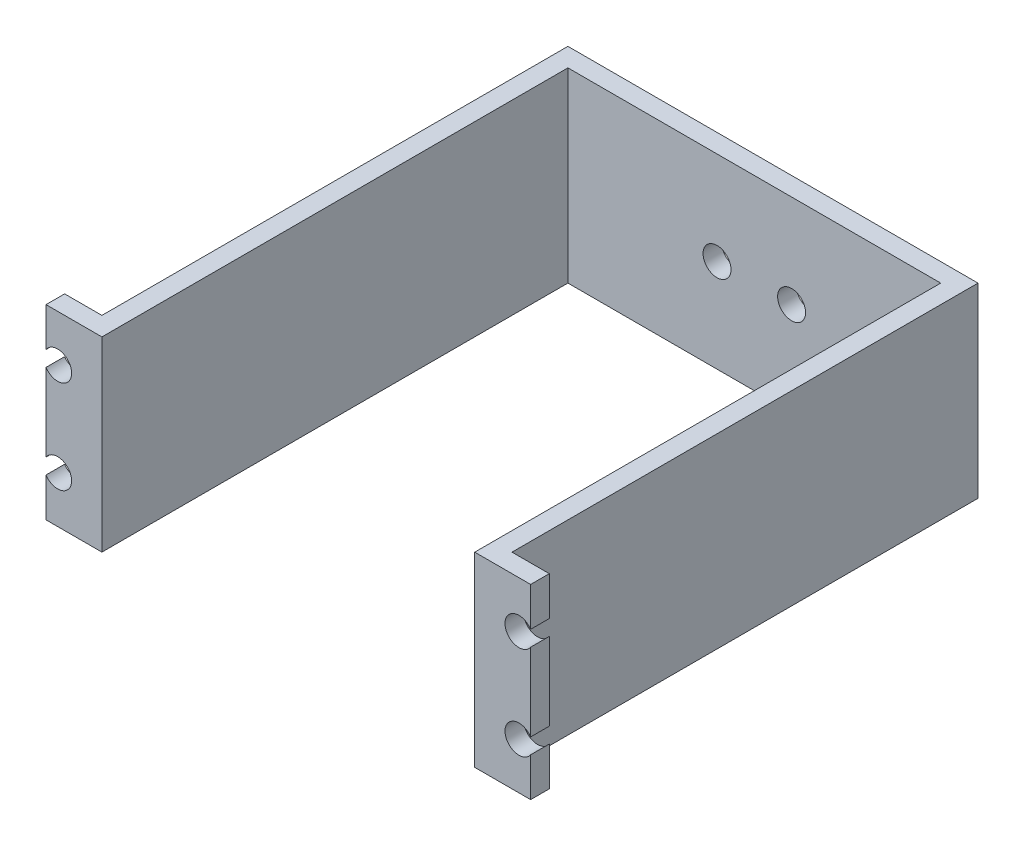
ISO-10303-21;
HEADER;
FILE_DESCRIPTION(('STEP AP214'),'2;1');
FILE_NAME('part.step','',(''),(''),'','','');
FILE_SCHEMA(('AUTOMOTIVE_DESIGN { 1 0 10303 214 1 1 1 1 }'));
ENDSEC;
DATA;
#1=APPLICATION_CONTEXT('core data for automotive mechanical design processes');
#2=APPLICATION_PROTOCOL_DEFINITION('international standard','automotive_design',2000,#1);
#3=PRODUCT_CONTEXT('',#1,'mechanical');
#4=PRODUCT('Part','Part','',(#3));
#5=PRODUCT_RELATED_PRODUCT_CATEGORY('part','',(#4));
#6=PRODUCT_DEFINITION_FORMATION('','',#4);
#7=PRODUCT_DEFINITION_CONTEXT('part definition',#1,'design');
#8=PRODUCT_DEFINITION('design','',#6,#7);
#9=PRODUCT_DEFINITION_SHAPE('','',#8);
#10=(LENGTH_UNIT() NAMED_UNIT(*) SI_UNIT(.MILLI.,.METRE.));
#11=(NAMED_UNIT(*) PLANE_ANGLE_UNIT() SI_UNIT($,.RADIAN.));
#12=(NAMED_UNIT(*) SI_UNIT($,.STERADIAN.) SOLID_ANGLE_UNIT());
#13=UNCERTAINTY_MEASURE_WITH_UNIT(LENGTH_MEASURE(1.E-05),#10,'distance_accuracy_value','');
#14=(GEOMETRIC_REPRESENTATION_CONTEXT(3) GLOBAL_UNCERTAINTY_ASSIGNED_CONTEXT((#13)) GLOBAL_UNIT_ASSIGNED_CONTEXT((#10,
#11,#12)) REPRESENTATION_CONTEXT('',''));
#15=CARTESIAN_POINT('',(0.,0.,0.));
#16=DIRECTION('',(0.,0.,1.));
#17=DIRECTION('',(1.,0.,0.));
#18=AXIS2_PLACEMENT_3D('',#15,#16,#17);
#19=CARTESIAN_POINT('',(-4.,0.,0.));
#20=DIRECTION('',(1.,0.,0.));
#21=DIRECTION('',(0.,0.,-1.));
#22=AXIS2_PLACEMENT_3D('',#19,#20,#21);
#23=PLANE('',#22);
#24=DIRECTION('',(0.,-1.,0.));
#25=VECTOR('',#24,1.);
#26=CARTESIAN_POINT('',(-4.,20.,49.9999999999998));
#27=LINE('',#26,#25);
#28=CARTESIAN_POINT('',(-4.,20.,49.9999999999998));
#29=VERTEX_POINT('',#28);
#30=CARTESIAN_POINT('',(-4.,15.8291561975888,49.9999999999998));
#31=VERTEX_POINT('',#30);
#32=EDGE_CURVE('E235',#29,#31,#27,.T.);
#33=ORIENTED_EDGE('',*,*,#32,.T.);
#34=DIRECTION('',(0.,0.,1.));
#35=VECTOR('',#34,1.);
#36=CARTESIAN_POINT('',(-4.,15.8291561975888,48.));
#37=LINE('',#36,#35);
#38=CARTESIAN_POINT('',(-4.,15.8291561975888,52.));
#39=VERTEX_POINT('',#38);
#40=EDGE_CURVE('E11',#31,#39,#37,.T.);
#41=ORIENTED_EDGE('',*,*,#40,.T.);
#42=DIRECTION('',(0.,1.,0.));
#43=VECTOR('',#42,1.);
#44=CARTESIAN_POINT('',(-4.,20.,51.9999999999996));
#45=LINE('',#44,#43);
#46=CARTESIAN_POINT('',(-4.,20.,51.9999999999996));
#47=VERTEX_POINT('',#46);
#48=EDGE_CURVE('E232',#39,#47,#45,.T.);
#49=ORIENTED_EDGE('',*,*,#48,.T.);
#50=DIRECTION('',(0.,0.,-1.));
#51=VECTOR('',#50,1.);
#52=CARTESIAN_POINT('',(-4.,20.,51.9999999999996));
#53=LINE('',#52,#51);
#54=EDGE_CURVE('E230',#47,#29,#53,.T.);
#55=ORIENTED_EDGE('',*,*,#54,.T.);
#56=EDGE_LOOP('',(#33,#41,#49,#55));
#57=FACE_BOUND('',#56,.T.);
#58=ADVANCED_FACE('F36',(#57),#23,.F.);
#59=CARTESIAN_POINT('',(-4.,5.82915619758885,52.));
#60=VERTEX_POINT('',#59);
#61=CARTESIAN_POINT('',(-4.,14.1708438024112,52.));
#62=VERTEX_POINT('',#61);
#63=EDGE_CURVE('E231',#60,#62,#45,.T.);
#64=ORIENTED_EDGE('',*,*,#63,.T.);
#65=DIRECTION('',(0.,0.,1.));
#66=VECTOR('',#65,1.);
#67=CARTESIAN_POINT('',(-4.,14.1708438024112,48.));
#68=LINE('',#67,#66);
#69=CARTESIAN_POINT('',(-4.,14.1708438024112,49.9999999999998));
#70=VERTEX_POINT('',#69);
#71=EDGE_CURVE('E44',#62,#70,#68,.F.);
#72=ORIENTED_EDGE('',*,*,#71,.T.);
#73=CARTESIAN_POINT('',(-4.,5.82915619758885,49.9999999999998));
#74=VERTEX_POINT('',#73);
#75=EDGE_CURVE('E239',#70,#74,#27,.T.);
#76=ORIENTED_EDGE('',*,*,#75,.T.);
#77=DIRECTION('',(0.,0.,1.));
#78=VECTOR('',#77,1.);
#79=CARTESIAN_POINT('',(-4.,5.82915619758885,48.));
#80=LINE('',#79,#78);
#81=EDGE_CURVE('E316',#74,#60,#80,.T.);
#82=ORIENTED_EDGE('',*,*,#81,.T.);
#83=EDGE_LOOP('',(#64,#72,#76,#82));
#84=FACE_BOUND('',#83,.T.);
#85=ADVANCED_FACE('F322',(#84),#23,.F.);
#86=CARTESIAN_POINT('',(48.,0.,0.));
#87=DIRECTION('',(1.,0.,0.));
#88=DIRECTION('',(0.,0.,-1.));
#89=AXIS2_PLACEMENT_3D('',#86,#87,#88);
#90=PLANE('',#89);
#91=DIRECTION('',(0.,0.,1.));
#92=VECTOR('',#91,1.);
#93=CARTESIAN_POINT('',(48.,5.82915619758885,48.));
#94=LINE('',#93,#92);
#95=CARTESIAN_POINT('',(48.,5.82915619758885,49.9999999999998));
#96=VERTEX_POINT('',#95);
#97=CARTESIAN_POINT('',(48.,5.82915619758885,52.));
#98=VERTEX_POINT('',#97);
#99=EDGE_CURVE('E172',#96,#98,#94,.T.);
#100=ORIENTED_EDGE('',*,*,#99,.F.);
#101=DIRECTION('',(0.,1.,0.));
#102=VECTOR('',#101,1.);
#103=CARTESIAN_POINT('',(48.,20.,49.9999999999998));
#104=LINE('',#103,#102);
#105=CARTESIAN_POINT('',(48.,14.1708438024112,49.9999999999998));
#106=VERTEX_POINT('',#105);
#107=EDGE_CURVE('E214',#96,#106,#104,.T.);
#108=ORIENTED_EDGE('',*,*,#107,.T.);
#109=DIRECTION('',(0.,0.,1.));
#110=VECTOR('',#109,1.);
#111=CARTESIAN_POINT('',(48.,14.1708438024112,48.));
#112=LINE('',#111,#110);
#113=CARTESIAN_POINT('',(48.,14.1708438024112,51.9999999999996));
#114=VERTEX_POINT('',#113);
#115=EDGE_CURVE('E198',#114,#106,#112,.F.);
#116=ORIENTED_EDGE('',*,*,#115,.F.);
#117=DIRECTION('',(0.,-1.,0.));
#118=VECTOR('',#117,1.);
#119=CARTESIAN_POINT('',(48.,20.,51.9999999999996));
#120=LINE('',#119,#118);
#121=EDGE_CURVE('E190',#114,#98,#120,.T.);
#122=ORIENTED_EDGE('',*,*,#121,.T.);
#123=EDGE_LOOP('',(#100,#108,#116,#122));
#124=FACE_BOUND('',#123,.T.);
#125=ADVANCED_FACE('F196',(#124),#90,.T.);
#126=DIRECTION('',(0.,0.,1.));
#127=VECTOR('',#126,1.);
#128=CARTESIAN_POINT('',(48.,15.8291561975888,48.));
#129=LINE('',#128,#127);
#130=CARTESIAN_POINT('',(48.,15.8291561975888,49.9999999999998));
#131=VERTEX_POINT('',#130);
#132=CARTESIAN_POINT('',(48.,15.8291561975888,52.));
#133=VERTEX_POINT('',#132);
#134=EDGE_CURVE('E312',#131,#133,#129,.T.);
#135=ORIENTED_EDGE('',*,*,#134,.F.);
#136=CARTESIAN_POINT('',(48.,20.,49.9999999999998));
#137=VERTEX_POINT('',#136);
#138=EDGE_CURVE('E209',#131,#137,#104,.T.);
#139=ORIENTED_EDGE('',*,*,#138,.T.);
#140=DIRECTION('',(0.,0.,1.));
#141=VECTOR('',#140,1.);
#142=CARTESIAN_POINT('',(48.,20.,51.9999999999996));
#143=LINE('',#142,#141);
#144=CARTESIAN_POINT('',(48.,20.,51.9999999999996));
#145=VERTEX_POINT('',#144);
#146=EDGE_CURVE('E213',#137,#145,#143,.T.);
#147=ORIENTED_EDGE('',*,*,#146,.T.);
#148=EDGE_CURVE('E199',#145,#133,#120,.T.);
#149=ORIENTED_EDGE('',*,*,#148,.T.);
#150=EDGE_LOOP('',(#135,#139,#147,#149));
#151=FACE_BOUND('',#150,.T.);
#152=ADVANCED_FACE('F385',(#151),#90,.T.);
#153=CARTESIAN_POINT('',(44.,0.,2.));
#154=DIRECTION('',(-1.,0.,0.));
#155=DIRECTION('',(0.,0.,1.));
#156=AXIS2_PLACEMENT_3D('',#153,#154,#155);
#157=PLANE('',#156);
#158=DIRECTION('',(0.,1.,0.));
#159=VECTOR('',#158,1.);
#160=CARTESIAN_POINT('',(44.,20.,49.9999999999998));
#161=LINE('',#160,#159);
#162=CARTESIAN_POINT('',(44.,0.,49.9999999999998));
#163=VERTEX_POINT('',#162);
#164=CARTESIAN_POINT('',(44.,20.,49.9999999999998));
#165=VERTEX_POINT('',#164);
#166=EDGE_CURVE('E203',#163,#165,#161,.T.);
#167=ORIENTED_EDGE('',*,*,#166,.F.);
#168=DIRECTION('',(0.,0.,-1.));
#169=VECTOR('',#168,1.);
#170=CARTESIAN_POINT('',(44.,0.,2.));
#171=LINE('',#170,#169);
#172=CARTESIAN_POINT('',(44.,0.,0.));
#173=VERTEX_POINT('',#172);
#174=EDGE_CURVE('E301',#163,#173,#171,.T.);
#175=ORIENTED_EDGE('',*,*,#174,.T.);
#176=DIRECTION('',(0.,1.,0.));
#177=VECTOR('',#176,1.);
#178=CARTESIAN_POINT('',(44.,0.,0.));
#179=LINE('',#178,#177);
#180=CARTESIAN_POINT('',(44.,20.,0.));
#181=VERTEX_POINT('',#180);
#182=EDGE_CURVE('E293',#173,#181,#179,.T.);
#183=ORIENTED_EDGE('',*,*,#182,.T.);
#184=DIRECTION('',(0.,0.,-1.));
#185=VECTOR('',#184,1.);
#186=CARTESIAN_POINT('',(44.,20.,2.));
#187=LINE('',#186,#185);
#188=EDGE_CURVE('E299',#165,#181,#187,.T.);
#189=ORIENTED_EDGE('',*,*,#188,.F.);
#190=EDGE_LOOP('',(#167,#175,#183,#189));
#191=FACE_BOUND('',#190,.T.);
#192=ADVANCED_FACE('F393',(#191),#157,.F.);
#193=CARTESIAN_POINT('',(0.,0.,2.));
#194=DIRECTION('',(1.,0.,0.));
#195=DIRECTION('',(0.,0.,-1.));
#196=AXIS2_PLACEMENT_3D('',#193,#194,#195);
#197=PLANE('',#196);
#198=DIRECTION('',(0.,-1.,0.));
#199=VECTOR('',#198,1.);
#200=CARTESIAN_POINT('',(0.,20.,49.9999999999998));
#201=LINE('',#200,#199);
#202=CARTESIAN_POINT('',(0.,20.,49.9999999999998));
#203=VERTEX_POINT('',#202);
#204=CARTESIAN_POINT('',(0.,0.,49.9999999999998));
#205=VERTEX_POINT('',#204);
#206=EDGE_CURVE('E226',#203,#205,#201,.T.);
#207=ORIENTED_EDGE('',*,*,#206,.F.);
#208=DIRECTION('',(0.,0.,-1.));
#209=VECTOR('',#208,1.);
#210=CARTESIAN_POINT('',(0.,20.,2.));
#211=LINE('',#210,#209);
#212=CARTESIAN_POINT('',(0.,20.,0.));
#213=VERTEX_POINT('',#212);
#214=EDGE_CURVE('E287',#203,#213,#211,.T.);
#215=ORIENTED_EDGE('',*,*,#214,.T.);
#216=DIRECTION('',(0.,-1.,0.));
#217=VECTOR('',#216,1.);
#218=CARTESIAN_POINT('',(0.,0.,0.));
#219=LINE('',#218,#217);
#220=CARTESIAN_POINT('',(0.,0.,0.));
#221=VERTEX_POINT('',#220);
#222=EDGE_CURVE('E281',#213,#221,#219,.T.);
#223=ORIENTED_EDGE('',*,*,#222,.T.);
#224=DIRECTION('',(0.,0.,-1.));
#225=VECTOR('',#224,1.);
#226=CARTESIAN_POINT('',(0.,0.,2.));
#227=LINE('',#226,#225);
#228=EDGE_CURVE('E303',#205,#221,#227,.T.);
#229=ORIENTED_EDGE('',*,*,#228,.F.);
#230=EDGE_LOOP('',(#207,#215,#223,#229));
#231=FACE_BOUND('',#230,.T.);
#232=ADVANCED_FACE('F38',(#231),#197,.F.);
#233=CARTESIAN_POINT('',(0.,0.,2.));
#234=DIRECTION('',(0.,0.,-1.));
#235=DIRECTION('',(-1.,0.,0.));
#236=AXIS2_PLACEMENT_3D('',#233,#234,#235);
#237=PLANE('',#236);
#238=CARTESIAN_POINT('',(26.,10.,2.));
#239=DIRECTION('',(0.,0.,1.));
#240=DIRECTION('',(1.,0.,0.));
#241=AXIS2_PLACEMENT_3D('',#238,#239,#240);
#242=CIRCLE('',#241,1.5);
#243=CARTESIAN_POINT('',(27.5,10.,2.));
#244=VERTEX_POINT('',#243);
#245=EDGE_CURVE('E310',#244,#244,#242,.T.);
#246=ORIENTED_EDGE('',*,*,#245,.F.);
#247=EDGE_LOOP('',(#246));
#248=FACE_BOUND('',#247,.T.);
#249=CARTESIAN_POINT('',(18.,10.,2.));
#250=DIRECTION('',(0.,0.,1.));
#251=DIRECTION('',(1.,0.,0.));
#252=AXIS2_PLACEMENT_3D('',#249,#250,#251);
#253=CIRCLE('',#252,1.5);
#254=CARTESIAN_POINT('',(19.5,10.,2.));
#255=VERTEX_POINT('',#254);
#256=EDGE_CURVE('E206',#255,#255,#253,.T.);
#257=ORIENTED_EDGE('',*,*,#256,.F.);
#258=EDGE_LOOP('',(#257));
#259=FACE_BOUND('',#258,.T.);
#260=DIRECTION('',(0.,-1.,0.));
#261=VECTOR('',#260,1.);
#262=CARTESIAN_POINT('',(42.,20.,2.));
#263=LINE('',#262,#261);
#264=CARTESIAN_POINT('',(42.,20.,2.));
#265=VERTEX_POINT('',#264);
#266=CARTESIAN_POINT('',(42.,0.,2.));
#267=VERTEX_POINT('',#266);
#268=EDGE_CURVE('E250',#265,#267,#263,.T.);
#269=ORIENTED_EDGE('',*,*,#268,.F.);
#270=DIRECTION('',(-1.,0.,0.));
#271=VECTOR('',#270,1.);
#272=CARTESIAN_POINT('',(0.,20.,2.));
#273=LINE('',#272,#271);
#274=CARTESIAN_POINT('',(2.,20.,2.));
#275=VERTEX_POINT('',#274);
#276=EDGE_CURVE('E284',#265,#275,#273,.T.);
#277=ORIENTED_EDGE('',*,*,#276,.T.);
#278=DIRECTION('',(0.,1.,0.));
#279=VECTOR('',#278,1.);
#280=CARTESIAN_POINT('',(2.,20.,2.));
#281=LINE('',#280,#279);
#282=CARTESIAN_POINT('',(2.,0.,2.));
#283=VERTEX_POINT('',#282);
#284=EDGE_CURVE('E265',#283,#275,#281,.T.);
#285=ORIENTED_EDGE('',*,*,#284,.F.);
#286=DIRECTION('',(1.,0.,0.));
#287=VECTOR('',#286,1.);
#288=CARTESIAN_POINT('',(0.,0.,2.));
#289=LINE('',#288,#287);
#290=EDGE_CURVE('E282',#283,#267,#289,.T.);
#291=ORIENTED_EDGE('',*,*,#290,.T.);
#292=EDGE_LOOP('',(#269,#277,#285,#291));
#293=FACE_BOUND('',#292,.T.);
#294=ADVANCED_FACE('F359',(#248,#259,#293),#237,.F.);
#295=CARTESIAN_POINT('',(0.,0.,2.));
#296=DIRECTION('',(0.,1.,0.));
#297=DIRECTION('',(0.,0.,1.));
#298=AXIS2_PLACEMENT_3D('',#295,#296,#297);
#299=PLANE('',#298);
#300=DIRECTION('',(1.,0.,0.));
#301=VECTOR('',#300,1.);
#302=CARTESIAN_POINT('',(0.,0.,0.));
#303=LINE('',#302,#301);
#304=EDGE_CURVE('E290',#221,#173,#303,.T.);
#305=ORIENTED_EDGE('',*,*,#304,.T.);
#306=ORIENTED_EDGE('',*,*,#174,.F.);
#307=DIRECTION('',(-1.,0.,0.));
#308=VECTOR('',#307,1.);
#309=CARTESIAN_POINT('',(48.,0.,49.9999999999998));
#310=LINE('',#309,#308);
#311=CARTESIAN_POINT('',(48.,0.,49.9999999999998));
#312=VERTEX_POINT('',#311);
#313=EDGE_CURVE('E223',#312,#163,#310,.T.);
#314=ORIENTED_EDGE('',*,*,#313,.F.);
#315=DIRECTION('',(0.,0.,-1.));
#316=VECTOR('',#315,1.);
#317=CARTESIAN_POINT('',(48.,0.,51.9999999999996));
#318=LINE('',#317,#316);
#319=CARTESIAN_POINT('',(48.,0.,51.9999999999996));
#320=VERTEX_POINT('',#319);
#321=EDGE_CURVE('E202',#320,#312,#318,.T.);
#322=ORIENTED_EDGE('',*,*,#321,.F.);
#323=DIRECTION('',(1.,0.,0.));
#324=VECTOR('',#323,1.);
#325=CARTESIAN_POINT('',(44.,0.,52.));
#326=LINE('',#325,#324);
#327=CARTESIAN_POINT('',(42.,0.,52.));
#328=VERTEX_POINT('',#327);
#329=EDGE_CURVE('E255',#328,#320,#326,.T.);
#330=ORIENTED_EDGE('',*,*,#329,.F.);
#331=DIRECTION('',(0.,0.,-1.));
#332=VECTOR('',#331,1.);
#333=CARTESIAN_POINT('',(42.,0.,52.));
#334=LINE('',#333,#332);
#335=EDGE_CURVE('E257',#328,#267,#334,.T.);
#336=ORIENTED_EDGE('',*,*,#335,.T.);
#337=ORIENTED_EDGE('',*,*,#290,.F.);
#338=DIRECTION('',(0.,0.,-1.));
#339=VECTOR('',#338,1.);
#340=CARTESIAN_POINT('',(2.,0.,52.));
#341=LINE('',#340,#339);
#342=CARTESIAN_POINT('',(2.,0.,52.));
#343=VERTEX_POINT('',#342);
#344=EDGE_CURVE('E278',#343,#283,#341,.T.);
#345=ORIENTED_EDGE('',*,*,#344,.F.);
#346=DIRECTION('',(1.,0.,0.));
#347=VECTOR('',#346,1.);
#348=CARTESIAN_POINT('',(0.,0.,52.));
#349=LINE('',#348,#347);
#350=CARTESIAN_POINT('',(-4.,0.,51.9999999999996));
#351=VERTEX_POINT('',#350);
#352=EDGE_CURVE('E266',#351,#343,#349,.T.);
#353=ORIENTED_EDGE('',*,*,#352,.F.);
#354=DIRECTION('',(0.,0.,1.));
#355=VECTOR('',#354,1.);
#356=CARTESIAN_POINT('',(-4.,0.,51.9999999999996));
#357=LINE('',#356,#355);
#358=CARTESIAN_POINT('',(-4.,0.,49.9999999999998));
#359=VERTEX_POINT('',#358);
#360=EDGE_CURVE('E238',#359,#351,#357,.T.);
#361=ORIENTED_EDGE('',*,*,#360,.F.);
#362=DIRECTION('',(1.,0.,0.));
#363=VECTOR('',#362,1.);
#364=CARTESIAN_POINT('',(-4.,0.,49.9999999999998));
#365=LINE('',#364,#363);
#366=EDGE_CURVE('E242',#359,#205,#365,.T.);
#367=ORIENTED_EDGE('',*,*,#366,.T.);
#368=ORIENTED_EDGE('',*,*,#228,.T.);
#369=EDGE_LOOP('',(#305,#306,#314,#322,#330,#336,#337,#345,#353,#361,#367,#368));
#370=FACE_BOUND('',#369,.T.);
#371=ADVANCED_FACE('F335',(#370),#299,.F.);
#372=CARTESIAN_POINT('',(0.,20.,2.));
#373=DIRECTION('',(0.,-1.,0.));
#374=DIRECTION('',(0.,0.,-1.));
#375=AXIS2_PLACEMENT_3D('',#372,#373,#374);
#376=PLANE('',#375);
#377=DIRECTION('',(-1.,0.,0.));
#378=VECTOR('',#377,1.);
#379=CARTESIAN_POINT('',(0.,20.,0.));
#380=LINE('',#379,#378);
#381=EDGE_CURVE('E285',#181,#213,#380,.T.);
#382=ORIENTED_EDGE('',*,*,#381,.T.);
#383=ORIENTED_EDGE('',*,*,#214,.F.);
#384=DIRECTION('',(1.,0.,0.));
#385=VECTOR('',#384,1.);
#386=CARTESIAN_POINT('',(-4.,20.,49.9999999999998));
#387=LINE('',#386,#385);
#388=EDGE_CURVE('E247',#29,#203,#387,.T.);
#389=ORIENTED_EDGE('',*,*,#388,.F.);
#390=ORIENTED_EDGE('',*,*,#54,.F.);
#391=DIRECTION('',(-1.,0.,0.));
#392=VECTOR('',#391,1.);
#393=CARTESIAN_POINT('',(0.,20.,52.));
#394=LINE('',#393,#392);
#395=CARTESIAN_POINT('',(2.,20.,52.));
#396=VERTEX_POINT('',#395);
#397=EDGE_CURVE('E270',#396,#47,#394,.T.);
#398=ORIENTED_EDGE('',*,*,#397,.F.);
#399=DIRECTION('',(0.,0.,-1.));
#400=VECTOR('',#399,1.);
#401=CARTESIAN_POINT('',(2.,20.,52.));
#402=LINE('',#401,#400);
#403=EDGE_CURVE('E273',#396,#275,#402,.T.);
#404=ORIENTED_EDGE('',*,*,#403,.T.);
#405=ORIENTED_EDGE('',*,*,#276,.F.);
#406=DIRECTION('',(0.,0.,-1.));
#407=VECTOR('',#406,1.);
#408=CARTESIAN_POINT('',(42.,20.,52.));
#409=LINE('',#408,#407);
#410=CARTESIAN_POINT('',(42.,20.,52.));
#411=VERTEX_POINT('',#410);
#412=EDGE_CURVE('E262',#411,#265,#409,.T.);
#413=ORIENTED_EDGE('',*,*,#412,.F.);
#414=DIRECTION('',(-1.,0.,0.));
#415=VECTOR('',#414,1.);
#416=CARTESIAN_POINT('',(44.,20.,52.));
#417=LINE('',#416,#415);
#418=EDGE_CURVE('E251',#145,#411,#417,.T.);
#419=ORIENTED_EDGE('',*,*,#418,.F.);
#420=ORIENTED_EDGE('',*,*,#146,.F.);
#421=DIRECTION('',(-1.,0.,0.));
#422=VECTOR('',#421,1.);
#423=CARTESIAN_POINT('',(48.,20.,49.9999999999998));
#424=LINE('',#423,#422);
#425=EDGE_CURVE('E217',#137,#165,#424,.T.);
#426=ORIENTED_EDGE('',*,*,#425,.T.);
#427=ORIENTED_EDGE('',*,*,#188,.T.);
#428=EDGE_LOOP('',(#382,#383,#389,#390,#398,#404,#405,#413,#419,#420,#426,#427));
#429=FACE_BOUND('',#428,.T.);
#430=ADVANCED_FACE('F373',(#429),#376,.F.);
#431=CARTESIAN_POINT('',(0.,0.,0.));
#432=DIRECTION('',(0.,0.,-1.));
#433=DIRECTION('',(-1.,0.,0.));
#434=AXIS2_PLACEMENT_3D('',#431,#432,#433);
#435=PLANE('',#434);
#436=CARTESIAN_POINT('',(26.,10.,0.));
#437=DIRECTION('',(0.,0.,-1.));
#438=DIRECTION('',(-1.,0.,0.));
#439=AXIS2_PLACEMENT_3D('',#436,#437,#438);
#440=CIRCLE('',#439,1.5);
#441=CARTESIAN_POINT('',(24.5,10.,0.));
#442=VERTEX_POINT('',#441);
#443=EDGE_CURVE('E307',#442,#442,#440,.T.);
#444=ORIENTED_EDGE('',*,*,#443,.F.);
#445=EDGE_LOOP('',(#444));
#446=FACE_BOUND('',#445,.T.);
#447=CARTESIAN_POINT('',(18.,10.,0.));
#448=DIRECTION('',(0.,0.,-1.));
#449=DIRECTION('',(-1.,0.,0.));
#450=AXIS2_PLACEMENT_3D('',#447,#448,#449);
#451=CIRCLE('',#450,1.5);
#452=CARTESIAN_POINT('',(16.5,10.,0.));
#453=VERTEX_POINT('',#452);
#454=EDGE_CURVE('E220',#453,#453,#451,.T.);
#455=ORIENTED_EDGE('',*,*,#454,.F.);
#456=EDGE_LOOP('',(#455));
#457=FACE_BOUND('',#456,.T.);
#458=ORIENTED_EDGE('',*,*,#222,.F.);
#459=ORIENTED_EDGE('',*,*,#381,.F.);
#460=ORIENTED_EDGE('',*,*,#182,.F.);
#461=ORIENTED_EDGE('',*,*,#304,.F.);
#462=EDGE_LOOP('',(#458,#459,#460,#461));
#463=FACE_BOUND('',#462,.T.);
#464=ADVANCED_FACE('F399',(#446,#457,#463),#435,.T.);
#465=CARTESIAN_POINT('',(2.,20.,52.));
#466=DIRECTION('',(-1.,0.,0.));
#467=DIRECTION('',(0.,-1.,0.));
#468=AXIS2_PLACEMENT_3D('',#465,#466,#467);
#469=PLANE('',#468);
#470=ORIENTED_EDGE('',*,*,#284,.T.);
#471=ORIENTED_EDGE('',*,*,#403,.F.);
#472=DIRECTION('',(0.,1.,0.));
#473=VECTOR('',#472,1.);
#474=CARTESIAN_POINT('',(2.,20.,52.));
#475=LINE('',#474,#473);
#476=EDGE_CURVE('E268',#343,#396,#475,.T.);
#477=ORIENTED_EDGE('',*,*,#476,.F.);
#478=ORIENTED_EDGE('',*,*,#344,.T.);
#479=EDGE_LOOP('',(#470,#471,#477,#478));
#480=FACE_BOUND('',#479,.T.);
#481=ADVANCED_FACE('F378',(#480),#469,.F.);
#482=CARTESIAN_POINT('',(0.,0.,52.));
#483=DIRECTION('',(0.,0.,1.));
#484=DIRECTION('',(1.,0.,0.));
#485=AXIS2_PLACEMENT_3D('',#482,#483,#484);
#486=PLANE('',#485);
#487=CARTESIAN_POINT('',(-2.75,15.,52.));
#488=DIRECTION('',(0.,0.,1.));
#489=DIRECTION('',(1.,0.,0.));
#490=AXIS2_PLACEMENT_3D('',#487,#488,#489);
#491=CIRCLE('',#490,1.5);
#492=EDGE_CURVE('E193',#62,#39,#491,.T.);
#493=ORIENTED_EDGE('',*,*,#492,.F.);
#494=ORIENTED_EDGE('',*,*,#63,.F.);
#495=CARTESIAN_POINT('',(-2.75,5.,52.));
#496=DIRECTION('',(0.,0.,1.));
#497=DIRECTION('',(1.,0.,0.));
#498=AXIS2_PLACEMENT_3D('',#495,#496,#497);
#499=CIRCLE('',#498,1.5);
#500=CARTESIAN_POINT('',(-4.,4.17084380241115,52.));
#501=VERTEX_POINT('',#500);
#502=EDGE_CURVE('E343',#501,#60,#499,.T.);
#503=ORIENTED_EDGE('',*,*,#502,.F.);
#504=EDGE_CURVE('E227',#351,#501,#45,.T.);
#505=ORIENTED_EDGE('',*,*,#504,.F.);
#506=ORIENTED_EDGE('',*,*,#352,.T.);
#507=ORIENTED_EDGE('',*,*,#476,.T.);
#508=ORIENTED_EDGE('',*,*,#397,.T.);
#509=ORIENTED_EDGE('',*,*,#48,.F.);
#510=EDGE_LOOP('',(#493,#494,#503,#505,#506,#507,#508,#509));
#511=FACE_BOUND('',#510,.T.);
#512=ADVANCED_FACE('F340',(#511),#486,.T.);
#513=CARTESIAN_POINT('',(42.,20.,52.));
#514=DIRECTION('',(1.,0.,0.));
#515=DIRECTION('',(0.,0.,-1.));
#516=AXIS2_PLACEMENT_3D('',#513,#514,#515);
#517=PLANE('',#516);
#518=ORIENTED_EDGE('',*,*,#268,.T.);
#519=ORIENTED_EDGE('',*,*,#335,.F.);
#520=DIRECTION('',(0.,-1.,0.));
#521=VECTOR('',#520,1.);
#522=CARTESIAN_POINT('',(42.,20.,52.));
#523=LINE('',#522,#521);
#524=EDGE_CURVE('E253',#411,#328,#523,.T.);
#525=ORIENTED_EDGE('',*,*,#524,.F.);
#526=ORIENTED_EDGE('',*,*,#412,.T.);
#527=EDGE_LOOP('',(#518,#519,#525,#526));
#528=FACE_BOUND('',#527,.T.);
#529=ADVANCED_FACE('F371',(#528),#517,.F.);
#530=CARTESIAN_POINT('',(0.,0.,52.));
#531=DIRECTION('',(0.,0.,-1.));
#532=DIRECTION('',(-1.,0.,0.));
#533=AXIS2_PLACEMENT_3D('',#530,#531,#532);
#534=PLANE('',#533);
#535=CARTESIAN_POINT('',(48.,4.17084380241115,51.9999999999996));
#536=VERTEX_POINT('',#535);
#537=EDGE_CURVE('E192',#536,#320,#120,.T.);
#538=ORIENTED_EDGE('',*,*,#537,.F.);
#539=CARTESIAN_POINT('',(46.75,5.,52.));
#540=DIRECTION('',(0.,0.,1.));
#541=DIRECTION('',(1.,0.,0.));
#542=AXIS2_PLACEMENT_3D('',#539,#540,#541);
#543=CIRCLE('',#542,1.5);
#544=EDGE_CURVE('E175',#98,#536,#543,.T.);
#545=ORIENTED_EDGE('',*,*,#544,.F.);
#546=ORIENTED_EDGE('',*,*,#121,.F.);
#547=CARTESIAN_POINT('',(46.75,15.,52.));
#548=DIRECTION('',(0.,0.,1.));
#549=DIRECTION('',(1.,0.,0.));
#550=AXIS2_PLACEMENT_3D('',#547,#548,#549);
#551=CIRCLE('',#550,1.5);
#552=EDGE_CURVE('E350',#133,#114,#551,.T.);
#553=ORIENTED_EDGE('',*,*,#552,.F.);
#554=ORIENTED_EDGE('',*,*,#148,.F.);
#555=ORIENTED_EDGE('',*,*,#418,.T.);
#556=ORIENTED_EDGE('',*,*,#524,.T.);
#557=ORIENTED_EDGE('',*,*,#329,.T.);
#558=EDGE_LOOP('',(#538,#545,#546,#553,#554,#555,#556,#557));
#559=FACE_BOUND('',#558,.T.);
#560=ADVANCED_FACE('F188',(#559),#534,.F.);
#561=CARTESIAN_POINT('',(-4.,20.,49.9999999999998));
#562=DIRECTION('',(0.,0.,1.));
#563=DIRECTION('',(1.,0.,0.));
#564=AXIS2_PLACEMENT_3D('',#561,#562,#563);
#565=PLANE('',#564);
#566=ORIENTED_EDGE('',*,*,#75,.F.);
#567=CARTESIAN_POINT('',(-2.75,15.,49.9999999999998));
#568=DIRECTION('',(0.,0.,1.));
#569=DIRECTION('',(1.,0.,0.));
#570=AXIS2_PLACEMENT_3D('',#567,#568,#569);
#571=CIRCLE('',#570,1.5);
#572=EDGE_CURVE('E59',#70,#31,#571,.T.);
#573=ORIENTED_EDGE('',*,*,#572,.T.);
#574=ORIENTED_EDGE('',*,*,#32,.F.);
#575=ORIENTED_EDGE('',*,*,#388,.T.);
#576=ORIENTED_EDGE('',*,*,#206,.T.);
#577=ORIENTED_EDGE('',*,*,#366,.F.);
#578=CARTESIAN_POINT('',(-4.,4.17084380241115,49.9999999999998));
#579=VERTEX_POINT('',#578);
#580=EDGE_CURVE('E234',#579,#359,#27,.T.);
#581=ORIENTED_EDGE('',*,*,#580,.F.);
#582=CARTESIAN_POINT('',(-2.75,5.,49.9999999999998));
#583=DIRECTION('',(0.,0.,1.));
#584=DIRECTION('',(1.,0.,0.));
#585=AXIS2_PLACEMENT_3D('',#582,#583,#584);
#586=CIRCLE('',#585,1.5);
#587=EDGE_CURVE('E51',#579,#74,#586,.T.);
#588=ORIENTED_EDGE('',*,*,#587,.T.);
#589=EDGE_LOOP('',(#566,#573,#574,#575,#576,#577,#581,#588));
#590=FACE_BOUND('',#589,.T.);
#591=ADVANCED_FACE('F326',(#590),#565,.F.);
#592=ORIENTED_EDGE('',*,*,#504,.T.);
#593=DIRECTION('',(0.,0.,1.));
#594=VECTOR('',#593,1.);
#595=CARTESIAN_POINT('',(-4.,4.17084380241115,48.));
#596=LINE('',#595,#594);
#597=EDGE_CURVE('E182',#501,#579,#596,.F.);
#598=ORIENTED_EDGE('',*,*,#597,.T.);
#599=ORIENTED_EDGE('',*,*,#580,.T.);
#600=ORIENTED_EDGE('',*,*,#360,.T.);
#601=EDGE_LOOP('',(#592,#598,#599,#600));
#602=FACE_BOUND('',#601,.T.);
#603=ADVANCED_FACE('F331',(#602),#23,.F.);
#604=CARTESIAN_POINT('',(48.,20.,49.9999999999998));
#605=DIRECTION('',(0.,0.,1.));
#606=DIRECTION('',(1.,0.,0.));
#607=AXIS2_PLACEMENT_3D('',#604,#605,#606);
#608=PLANE('',#607);
#609=ORIENTED_EDGE('',*,*,#107,.F.);
#610=CARTESIAN_POINT('',(46.75,5.,49.9999999999998));
#611=DIRECTION('',(0.,0.,1.));
#612=DIRECTION('',(1.,0.,0.));
#613=AXIS2_PLACEMENT_3D('',#610,#611,#612);
#614=CIRCLE('',#613,1.5);
#615=CARTESIAN_POINT('',(48.,4.17084380241116,49.9999999999998));
#616=VERTEX_POINT('',#615);
#617=EDGE_CURVE('E178',#96,#616,#614,.T.);
#618=ORIENTED_EDGE('',*,*,#617,.T.);
#619=EDGE_CURVE('E210',#312,#616,#104,.T.);
#620=ORIENTED_EDGE('',*,*,#619,.F.);
#621=ORIENTED_EDGE('',*,*,#313,.T.);
#622=ORIENTED_EDGE('',*,*,#166,.T.);
#623=ORIENTED_EDGE('',*,*,#425,.F.);
#624=ORIENTED_EDGE('',*,*,#138,.F.);
#625=CARTESIAN_POINT('',(46.75,15.,49.9999999999998));
#626=DIRECTION('',(0.,0.,1.));
#627=DIRECTION('',(1.,0.,0.));
#628=AXIS2_PLACEMENT_3D('',#625,#626,#627);
#629=CIRCLE('',#628,1.5);
#630=EDGE_CURVE('E352',#131,#106,#629,.T.);
#631=ORIENTED_EDGE('',*,*,#630,.T.);
#632=EDGE_LOOP('',(#609,#618,#620,#621,#622,#623,#624,#631));
#633=FACE_BOUND('',#632,.T.);
#634=ADVANCED_FACE('F389',(#633),#608,.F.);
#635=DIRECTION('',(0.,0.,1.));
#636=VECTOR('',#635,1.);
#637=CARTESIAN_POINT('',(48.,4.17084380241116,48.));
#638=LINE('',#637,#636);
#639=EDGE_CURVE('E183',#536,#616,#638,.F.);
#640=ORIENTED_EDGE('',*,*,#639,.F.);
#641=ORIENTED_EDGE('',*,*,#537,.T.);
#642=ORIENTED_EDGE('',*,*,#321,.T.);
#643=ORIENTED_EDGE('',*,*,#619,.T.);
#644=EDGE_LOOP('',(#640,#641,#642,#643));
#645=FACE_BOUND('',#644,.T.);
#646=ADVANCED_FACE('F426',(#645),#90,.T.);
#647=CARTESIAN_POINT('',(18.,10.,-2.));
#648=DIRECTION('',(0.,0.,1.));
#649=DIRECTION('',(1.,0.,0.));
#650=AXIS2_PLACEMENT_3D('',#647,#648,#649);
#651=CYLINDRICAL_SURFACE('',#650,1.5);
#652=ORIENTED_EDGE('',*,*,#454,.T.);
#653=EDGE_LOOP('',(#652));
#654=FACE_BOUND('',#653,.T.);
#655=ORIENTED_EDGE('',*,*,#256,.T.);
#656=EDGE_LOOP('',(#655));
#657=FACE_BOUND('',#656,.T.);
#658=ADVANCED_FACE('F503',(#654,#657),#651,.F.);
#659=CARTESIAN_POINT('',(26.,10.,-2.));
#660=DIRECTION('',(0.,0.,1.));
#661=DIRECTION('',(1.,0.,0.));
#662=AXIS2_PLACEMENT_3D('',#659,#660,#661);
#663=CYLINDRICAL_SURFACE('',#662,1.5);
#664=ORIENTED_EDGE('',*,*,#443,.T.);
#665=EDGE_LOOP('',(#664));
#666=FACE_BOUND('',#665,.T.);
#667=ORIENTED_EDGE('',*,*,#245,.T.);
#668=EDGE_LOOP('',(#667));
#669=FACE_BOUND('',#668,.T.);
#670=ADVANCED_FACE('F357',(#666,#669),#663,.F.);
#671=CARTESIAN_POINT('',(46.75,15.,48.));
#672=DIRECTION('',(0.,0.,1.));
#673=DIRECTION('',(1.,0.,0.));
#674=AXIS2_PLACEMENT_3D('',#671,#672,#673);
#675=CYLINDRICAL_SURFACE('',#674,1.5);
#676=ORIENTED_EDGE('',*,*,#134,.T.);
#677=ORIENTED_EDGE('',*,*,#552,.T.);
#678=ORIENTED_EDGE('',*,*,#115,.T.);
#679=ORIENTED_EDGE('',*,*,#630,.F.);
#680=EDGE_LOOP('',(#676,#677,#678,#679));
#681=FACE_BOUND('',#680,.T.);
#682=ADVANCED_FACE('F511',(#681),#675,.F.);
#683=CARTESIAN_POINT('',(46.75,5.,48.));
#684=DIRECTION('',(0.,0.,1.));
#685=DIRECTION('',(1.,0.,0.));
#686=AXIS2_PLACEMENT_3D('',#683,#684,#685);
#687=CYLINDRICAL_SURFACE('',#686,1.5);
#688=ORIENTED_EDGE('',*,*,#99,.T.);
#689=ORIENTED_EDGE('',*,*,#544,.T.);
#690=ORIENTED_EDGE('',*,*,#639,.T.);
#691=ORIENTED_EDGE('',*,*,#617,.F.);
#692=EDGE_LOOP('',(#688,#689,#690,#691));
#693=FACE_BOUND('',#692,.T.);
#694=ADVANCED_FACE('F174',(#693),#687,.F.);
#695=CARTESIAN_POINT('',(-2.75,5.,48.));
#696=DIRECTION('',(0.,0.,1.));
#697=DIRECTION('',(1.,0.,0.));
#698=AXIS2_PLACEMENT_3D('',#695,#696,#697);
#699=CYLINDRICAL_SURFACE('',#698,1.5);
#700=ORIENTED_EDGE('',*,*,#587,.F.);
#701=ORIENTED_EDGE('',*,*,#597,.F.);
#702=ORIENTED_EDGE('',*,*,#502,.T.);
#703=ORIENTED_EDGE('',*,*,#81,.F.);
#704=EDGE_LOOP('',(#700,#701,#702,#703));
#705=FACE_BOUND('',#704,.T.);
#706=ADVANCED_FACE('F407',(#705),#699,.F.);
#707=CARTESIAN_POINT('',(-2.75,15.,48.));
#708=DIRECTION('',(0.,0.,1.));
#709=DIRECTION('',(1.,0.,0.));
#710=AXIS2_PLACEMENT_3D('',#707,#708,#709);
#711=CYLINDRICAL_SURFACE('',#710,1.5);
#712=ORIENTED_EDGE('',*,*,#572,.F.);
#713=ORIENTED_EDGE('',*,*,#71,.F.);
#714=ORIENTED_EDGE('',*,*,#492,.T.);
#715=ORIENTED_EDGE('',*,*,#40,.F.);
#716=EDGE_LOOP('',(#712,#713,#714,#715));
#717=FACE_BOUND('',#716,.T.);
#718=ADVANCED_FACE('F405',(#717),#711,.F.);
#719=CLOSED_SHELL('',(#58,#85,#125,#152,#192,#232,#294,#371,#430,#464,#481,#512,#529,#560,#591,
#603,#634,#646,#658,#670,#682,#694,#706,#718));
#720=MANIFOLD_SOLID_BREP('B2',#719);
#721=ADVANCED_BREP_SHAPE_REPRESENTATION('',(#18,#720),#14);
#722=SHAPE_DEFINITION_REPRESENTATION(#9,#721);
ENDSEC;
END-ISO-10303-21;
